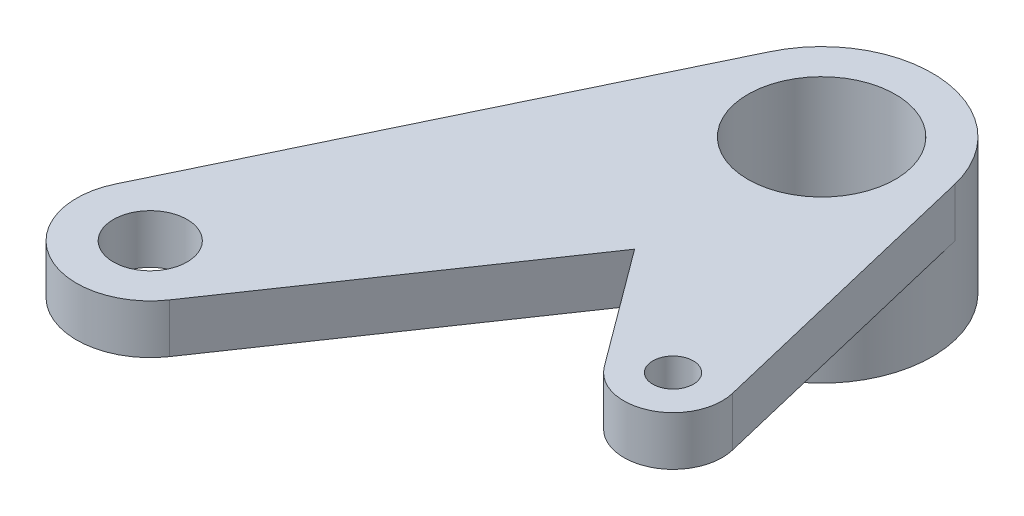
ISO-10303-21;
HEADER;
FILE_DESCRIPTION(('STEP AP214'),'2;1');
FILE_NAME('part.step','',(''),(''),'','','');
FILE_SCHEMA(('AUTOMOTIVE_DESIGN { 1 0 10303 214 1 1 1 1 }'));
ENDSEC;
DATA;
#1=APPLICATION_CONTEXT('core data for automotive mechanical design processes');
#2=APPLICATION_PROTOCOL_DEFINITION('international standard','automotive_design',2000,#1);
#3=PRODUCT_CONTEXT('',#1,'mechanical');
#4=PRODUCT('Part','Part','',(#3));
#5=PRODUCT_RELATED_PRODUCT_CATEGORY('part','',(#4));
#6=PRODUCT_DEFINITION_FORMATION('','',#4);
#7=PRODUCT_DEFINITION_CONTEXT('part definition',#1,'design');
#8=PRODUCT_DEFINITION('design','',#6,#7);
#9=PRODUCT_DEFINITION_SHAPE('','',#8);
#10=(LENGTH_UNIT() NAMED_UNIT(*) SI_UNIT(.MILLI.,.METRE.));
#11=(NAMED_UNIT(*) PLANE_ANGLE_UNIT() SI_UNIT($,.RADIAN.));
#12=(NAMED_UNIT(*) SI_UNIT($,.STERADIAN.) SOLID_ANGLE_UNIT());
#13=UNCERTAINTY_MEASURE_WITH_UNIT(LENGTH_MEASURE(1.E-05),#10,'distance_accuracy_value','');
#14=(GEOMETRIC_REPRESENTATION_CONTEXT(3) GLOBAL_UNCERTAINTY_ASSIGNED_CONTEXT((#13)) GLOBAL_UNIT_ASSIGNED_CONTEXT((#10,
#11,#12)) REPRESENTATION_CONTEXT('',''));
#15=CARTESIAN_POINT('',(0.,0.,0.));
#16=DIRECTION('',(0.,0.,1.));
#17=DIRECTION('',(1.,0.,0.));
#18=AXIS2_PLACEMENT_3D('',#15,#16,#17);
#19=CARTESIAN_POINT('',(4.16810157618354,7.29527531791811,-12.2850422261165));
#20=DIRECTION('',(0.,-1.,0.));
#21=DIRECTION('',(0.,0.,-1.));
#22=AXIS2_PLACEMENT_3D('',#19,#20,#21);
#23=CYLINDRICAL_SURFACE('',#22,18.);
#24=DIRECTION('',(0.,-1.,0.));
#25=VECTOR('',#24,1.);
#26=CARTESIAN_POINT('',(21.6734670411358,7.29527531791811,-16.4757676929608));
#27=LINE('',#26,#25);
#28=CARTESIAN_POINT('',(21.6734670411358,7.29527531791811,-16.4757676929608));
#29=VERTEX_POINT('',#28);
#30=CARTESIAN_POINT('',(21.6734670411358,-0.704724682081886,-16.4757676929608));
#31=VERTEX_POINT('',#30);
#32=EDGE_CURVE('E125',#29,#31,#27,.T.);
#33=ORIENTED_EDGE('',*,*,#32,.T.);
#34=CARTESIAN_POINT('',(4.16810157618354,-0.704724682081886,-12.2850422261165));
#35=DIRECTION('',(0.,1.,0.));
#36=DIRECTION('',(0.,0.,1.));
#37=AXIS2_PLACEMENT_3D('',#34,#35,#36);
#38=CIRCLE('',#37,18.);
#39=CARTESIAN_POINT('',(-12.0514513282907,-0.704724682081886,-20.0905597348381));
#40=VERTEX_POINT('',#39);
#41=EDGE_CURVE('E11',#40,#31,#38,.T.);
#42=ORIENTED_EDGE('',*,*,#41,.F.);
#43=DIRECTION('',(0.,-1.,0.));
#44=VECTOR('',#43,1.);
#45=CARTESIAN_POINT('',(-12.0514513282907,7.29527531791811,-20.0905597348381));
#46=LINE('',#45,#44);
#47=CARTESIAN_POINT('',(-12.0514513282907,7.29527531791811,-20.0905597348381));
#48=VERTEX_POINT('',#47);
#49=EDGE_CURVE('E46',#48,#40,#46,.T.);
#50=ORIENTED_EDGE('',*,*,#49,.F.);
#51=CARTESIAN_POINT('',(4.16810157618354,7.29527531791811,-12.2850422261165));
#52=DIRECTION('',(0.,1.,0.));
#53=DIRECTION('',(0.,0.,1.));
#54=AXIS2_PLACEMENT_3D('',#51,#52,#53);
#55=CIRCLE('',#54,18.);
#56=EDGE_CURVE('E140',#29,#48,#55,.T.);
#57=ORIENTED_EDGE('',*,*,#56,.F.);
#58=EDGE_LOOP('',(#33,#42,#50,#57));
#59=FACE_BOUND('',#58,.T.);
#60=CARTESIAN_POINT('',(4.16810157618354,-14.7047246820819,-12.2850422261165));
#61=DIRECTION('',(0.,1.,0.));
#62=DIRECTION('',(0.,0.,1.));
#63=AXIS2_PLACEMENT_3D('',#60,#61,#62);
#64=CIRCLE('',#63,18.);
#65=CARTESIAN_POINT('',(4.16810157618354,-14.7047246820819,5.71495777388353));
#66=VERTEX_POINT('',#65);
#67=EDGE_CURVE('E132',#66,#66,#64,.T.);
#68=ORIENTED_EDGE('',*,*,#67,.T.);
#69=EDGE_LOOP('',(#68));
#70=FACE_BOUND('',#69,.T.);
#71=ADVANCED_FACE('F37',(#59,#70),#23,.T.);
#72=CARTESIAN_POINT('',(-12.0514513282907,7.29527531791811,-20.0905597348381));
#73=DIRECTION('',(0.901086272470793,0.,0.433639861595646));
#74=DIRECTION('',(0.433639861595646,0.,-0.901086272470793));
#75=AXIS2_PLACEMENT_3D('',#72,#73,#74);
#76=PLANE('',#75);
#77=DIRECTION('',(-0.433639861595646,0.,0.901086272470793));
#78=VECTOR('',#77,1.);
#79=CARTESIAN_POINT('',(-12.0514513282907,-0.704724682081886,-20.0905597348381));
#80=LINE('',#79,#78);
#81=CARTESIAN_POINT('',(-46.6449336934661,-0.704724682081886,51.7933117374908));
#82=VERTEX_POINT('',#81);
#83=EDGE_CURVE('E129',#40,#82,#80,.T.);
#84=ORIENTED_EDGE('',*,*,#83,.T.);
#85=DIRECTION('',(0.,-1.,0.));
#86=VECTOR('',#85,1.);
#87=CARTESIAN_POINT('',(-46.6449336934661,7.29527531791811,51.7933117374908));
#88=LINE('',#87,#86);
#89=CARTESIAN_POINT('',(-46.6449336934661,7.29527531791811,51.7933117374908));
#90=VERTEX_POINT('',#89);
#91=EDGE_CURVE('E148',#90,#82,#88,.T.);
#92=ORIENTED_EDGE('',*,*,#91,.F.);
#93=DIRECTION('',(-0.433639861595646,0.,0.901086272470793));
#94=VECTOR('',#93,1.);
#95=CARTESIAN_POINT('',(-12.0514513282907,7.29527531791811,-20.0905597348381));
#96=LINE('',#95,#94);
#97=EDGE_CURVE('E94',#48,#90,#96,.T.);
#98=ORIENTED_EDGE('',*,*,#97,.F.);
#99=ORIENTED_EDGE('',*,*,#49,.T.);
#100=EDGE_LOOP('',(#84,#92,#98,#99));
#101=FACE_BOUND('',#100,.T.);
#102=ADVANCED_FACE('F192',(#101),#76,.F.);
#103=CARTESIAN_POINT('',(-35.8318984238165,7.29527531791811,56.9969900766386));
#104=DIRECTION('',(0.,-1.,0.));
#105=DIRECTION('',(0.,0.,-1.));
#106=AXIS2_PLACEMENT_3D('',#103,#104,#105);
#107=CYLINDRICAL_SURFACE('',#106,12.);
#108=CARTESIAN_POINT('',(-35.8318984238165,-0.704724682081886,56.9969900766386));
#109=DIRECTION('',(0.,1.,0.));
#110=DIRECTION('',(0.,0.,1.));
#111=AXIS2_PLACEMENT_3D('',#108,#109,#110);
#112=CIRCLE('',#111,12.);
#113=CARTESIAN_POINT('',(-25.918863154167,-0.704724682081886,63.7595141425983));
#114=VERTEX_POINT('',#113);
#115=EDGE_CURVE('E131',#82,#114,#112,.T.);
#116=ORIENTED_EDGE('',*,*,#115,.T.);
#117=DIRECTION('',(0.,-1.,0.));
#118=VECTOR('',#117,1.);
#119=CARTESIAN_POINT('',(-25.918863154167,7.29527531791811,63.7595141425983));
#120=LINE('',#119,#118);
#121=CARTESIAN_POINT('',(-25.918863154167,7.29527531791811,63.7595141425983));
#122=VERTEX_POINT('',#121);
#123=EDGE_CURVE('E145',#122,#114,#120,.T.);
#124=ORIENTED_EDGE('',*,*,#123,.F.);
#125=CARTESIAN_POINT('',(-35.8318984238165,7.29527531791811,56.9969900766386));
#126=DIRECTION('',(0.,1.,0.));
#127=DIRECTION('',(0.,0.,1.));
#128=AXIS2_PLACEMENT_3D('',#125,#126,#127);
#129=CIRCLE('',#128,12.);
#130=EDGE_CURVE('E176',#90,#122,#129,.T.);
#131=ORIENTED_EDGE('',*,*,#130,.F.);
#132=ORIENTED_EDGE('',*,*,#91,.T.);
#133=EDGE_LOOP('',(#116,#124,#131,#132));
#134=FACE_BOUND('',#133,.T.);
#135=ADVANCED_FACE('F180',(#134),#107,.T.);
#136=CARTESIAN_POINT('',(4.77402818421152,7.29527531791811,18.7674798966269));
#137=DIRECTION('',(-0.826086272470793,0.,-0.563543672163312));
#138=DIRECTION('',(-0.563543672163312,0.,0.826086272470793));
#139=AXIS2_PLACEMENT_3D('',#136,#137,#138);
#140=PLANE('',#139);
#141=DIRECTION('',(0.563543672163312,0.,-0.826086272470793));
#142=VECTOR('',#141,1.);
#143=CARTESIAN_POINT('',(4.77402818421152,-0.704724682081886,18.7674798966269));
#144=LINE('',#143,#142);
#145=CARTESIAN_POINT('',(4.77402818421152,-0.704724682081886,18.7674798966269));
#146=VERTEX_POINT('',#145);
#147=EDGE_CURVE('E134',#114,#146,#144,.T.);
#148=ORIENTED_EDGE('',*,*,#147,.T.);
#149=DIRECTION('',(0.,-1.,0.));
#150=VECTOR('',#149,1.);
#151=CARTESIAN_POINT('',(4.77402818421152,7.29527531791811,18.7674798966269));
#152=LINE('',#151,#150);
#153=CARTESIAN_POINT('',(4.77402818421152,7.29527531791811,18.7674798966269));
#154=VERTEX_POINT('',#153);
#155=EDGE_CURVE('E120',#154,#146,#152,.T.);
#156=ORIENTED_EDGE('',*,*,#155,.F.);
#157=DIRECTION('',(0.563543672163312,0.,-0.826086272470793));
#158=VECTOR('',#157,1.);
#159=CARTESIAN_POINT('',(4.77402818421152,7.29527531791811,18.7674798966269));
#160=LINE('',#159,#158);
#161=EDGE_CURVE('E111',#122,#154,#160,.T.);
#162=ORIENTED_EDGE('',*,*,#161,.F.);
#163=ORIENTED_EDGE('',*,*,#123,.T.);
#164=EDGE_LOOP('',(#148,#156,#162,#163));
#165=FACE_BOUND('',#164,.T.);
#166=ADVANCED_FACE('F184',(#165),#140,.F.);
#167=CARTESIAN_POINT('',(18.8712306719212,7.29527531791811,37.7930766961641));
#168=DIRECTION('',(0.803472998912177,0.,-0.595341196306011));
#169=DIRECTION('',(-0.595341196306011,0.,-0.803472998912177));
#170=AXIS2_PLACEMENT_3D('',#167,#168,#169);
#171=PLANE('',#170);
#172=DIRECTION('',(0.595341196306011,0.,0.803472998912177));
#173=VECTOR('',#172,1.);
#174=CARTESIAN_POINT('',(18.8712306719212,-0.704724682081886,37.7930766961641));
#175=LINE('',#174,#173);
#176=CARTESIAN_POINT('',(18.8712306719212,-0.704724682081886,37.7930766961641));
#177=VERTEX_POINT('',#176);
#178=EDGE_CURVE('E119',#146,#177,#175,.T.);
#179=ORIENTED_EDGE('',*,*,#178,.T.);
#180=DIRECTION('',(0.,-1.,0.));
#181=VECTOR('',#180,1.);
#182=CARTESIAN_POINT('',(18.8712306719212,7.29527531791811,37.7930766961641));
#183=LINE('',#182,#181);
#184=CARTESIAN_POINT('',(18.8712306719212,7.29527531791811,37.7930766961641));
#185=VERTEX_POINT('',#184);
#186=EDGE_CURVE('E116',#185,#177,#183,.T.);
#187=ORIENTED_EDGE('',*,*,#186,.F.);
#188=DIRECTION('',(0.595341196306011,0.,0.803472998912177));
#189=VECTOR('',#188,1.);
#190=CARTESIAN_POINT('',(18.8712306719212,7.29527531791811,37.7930766961641));
#191=LINE('',#190,#189);
#192=EDGE_CURVE('E105',#154,#185,#191,.T.);
#193=ORIENTED_EDGE('',*,*,#192,.F.);
#194=ORIENTED_EDGE('',*,*,#155,.T.);
#195=EDGE_LOOP('',(#179,#187,#193,#194));
#196=FACE_BOUND('',#195,.T.);
#197=ADVANCED_FACE('F117',(#196),#171,.F.);
#198=CARTESIAN_POINT('',(25.2990146632186,7.29527531791811,33.030347125716));
#199=DIRECTION('',(0.,-1.,0.));
#200=DIRECTION('',(0.,0.,-1.));
#201=AXIS2_PLACEMENT_3D('',#198,#199,#200);
#202=CYLINDRICAL_SURFACE('',#201,8.);
#203=CARTESIAN_POINT('',(25.2990146632186,-0.704724682081886,33.030347125716));
#204=DIRECTION('',(0.,1.,0.));
#205=DIRECTION('',(0.,0.,1.));
#206=AXIS2_PLACEMENT_3D('',#203,#204,#205);
#207=CIRCLE('',#206,8.);
#208=CARTESIAN_POINT('',(33.0791770920862,-0.704724682081886,31.1678024737852));
#209=VERTEX_POINT('',#208);
#210=EDGE_CURVE('E79',#177,#209,#207,.T.);
#211=ORIENTED_EDGE('',*,*,#210,.T.);
#212=DIRECTION('',(0.,-1.,0.));
#213=VECTOR('',#212,1.);
#214=CARTESIAN_POINT('',(33.0791770920862,7.29527531791811,31.1678024737852));
#215=LINE('',#214,#213);
#216=CARTESIAN_POINT('',(33.0791770920862,7.29527531791811,31.1678024737852));
#217=VERTEX_POINT('',#216);
#218=EDGE_CURVE('E121',#217,#209,#215,.T.);
#219=ORIENTED_EDGE('',*,*,#218,.F.);
#220=CARTESIAN_POINT('',(25.2990146632186,7.29527531791811,33.030347125716));
#221=DIRECTION('',(0.,1.,0.));
#222=DIRECTION('',(0.,0.,1.));
#223=AXIS2_PLACEMENT_3D('',#220,#221,#222);
#224=CIRCLE('',#223,8.);
#225=EDGE_CURVE('E109',#185,#217,#224,.T.);
#226=ORIENTED_EDGE('',*,*,#225,.F.);
#227=ORIENTED_EDGE('',*,*,#186,.T.);
#228=EDGE_LOOP('',(#211,#219,#226,#227));
#229=FACE_BOUND('',#228,.T.);
#230=ADVANCED_FACE('F123',(#229),#202,.T.);
#231=CARTESIAN_POINT('',(21.6734670411358,7.29527531791811,-16.4757676929608));
#232=DIRECTION('',(-0.972520303608458,0.,0.232818081491352));
#233=DIRECTION('',(0.232818081491352,0.,0.972520303608458));
#234=AXIS2_PLACEMENT_3D('',#231,#232,#233);
#235=PLANE('',#234);
#236=DIRECTION('',(-0.232818081491352,0.,-0.972520303608458));
#237=VECTOR('',#236,1.);
#238=CARTESIAN_POINT('',(21.6734670411358,-0.704724682081886,-16.4757676929608));
#239=LINE('',#238,#237);
#240=EDGE_CURVE('E138',#209,#31,#239,.T.);
#241=ORIENTED_EDGE('',*,*,#240,.T.);
#242=ORIENTED_EDGE('',*,*,#32,.F.);
#243=DIRECTION('',(-0.232818081491352,0.,-0.972520303608458));
#244=VECTOR('',#243,1.);
#245=CARTESIAN_POINT('',(21.6734670411358,7.29527531791811,-16.4757676929608));
#246=LINE('',#245,#244);
#247=EDGE_CURVE('E55',#217,#29,#246,.T.);
#248=ORIENTED_EDGE('',*,*,#247,.F.);
#249=ORIENTED_EDGE('',*,*,#218,.T.);
#250=EDGE_LOOP('',(#241,#242,#248,#249));
#251=FACE_BOUND('',#250,.T.);
#252=ADVANCED_FACE('F187',(#251),#235,.F.);
#253=CARTESIAN_POINT('',(4.16810157618354,7.29527531791811,-12.2850422261165));
#254=DIRECTION('',(0.,1.,0.));
#255=DIRECTION('',(0.,0.,1.));
#256=AXIS2_PLACEMENT_3D('',#253,#254,#255);
#257=PLANE('',#256);
#258=CARTESIAN_POINT('',(4.16810157618354,7.29527531791811,-12.2850422261165));
#259=DIRECTION('',(0.,1.,0.));
#260=DIRECTION('',(0.,0.,1.));
#261=AXIS2_PLACEMENT_3D('',#258,#259,#260);
#262=CIRCLE('',#261,12.);
#263=CARTESIAN_POINT('',(4.16810157618354,7.29527531791811,-0.285042226116474));
#264=VERTEX_POINT('',#263);
#265=EDGE_CURVE('E168',#264,#264,#262,.T.);
#266=ORIENTED_EDGE('',*,*,#265,.F.);
#267=EDGE_LOOP('',(#266));
#268=FACE_BOUND('',#267,.T.);
#269=CARTESIAN_POINT('',(25.2990146632186,7.29527531791812,33.030347125716));
#270=DIRECTION('',(0.,1.,0.));
#271=DIRECTION('',(0.,0.,1.));
#272=AXIS2_PLACEMENT_3D('',#269,#270,#271);
#273=CIRCLE('',#272,3.29999999999998);
#274=CARTESIAN_POINT('',(25.2990146632186,7.29527531791812,36.330347125716));
#275=VERTEX_POINT('',#274);
#276=EDGE_CURVE('E157',#275,#275,#273,.T.);
#277=ORIENTED_EDGE('',*,*,#276,.F.);
#278=EDGE_LOOP('',(#277));
#279=FACE_BOUND('',#278,.T.);
#280=CARTESIAN_POINT('',(-35.8318984238165,7.29527531791811,56.9969900766386));
#281=DIRECTION('',(0.,1.,0.));
#282=DIRECTION('',(0.,0.,1.));
#283=AXIS2_PLACEMENT_3D('',#280,#281,#282);
#284=CIRCLE('',#283,6.);
#285=CARTESIAN_POINT('',(-35.8318984238165,7.29527531791811,62.9969900766386));
#286=VERTEX_POINT('',#285);
#287=EDGE_CURVE('E154',#286,#286,#284,.T.);
#288=ORIENTED_EDGE('',*,*,#287,.F.);
#289=EDGE_LOOP('',(#288));
#290=FACE_BOUND('',#289,.T.);
#291=ORIENTED_EDGE('',*,*,#247,.T.);
#292=ORIENTED_EDGE('',*,*,#56,.T.);
#293=ORIENTED_EDGE('',*,*,#97,.T.);
#294=ORIENTED_EDGE('',*,*,#130,.T.);
#295=ORIENTED_EDGE('',*,*,#161,.T.);
#296=ORIENTED_EDGE('',*,*,#192,.T.);
#297=ORIENTED_EDGE('',*,*,#225,.T.);
#298=EDGE_LOOP('',(#291,#292,#293,#294,#295,#296,#297));
#299=FACE_BOUND('',#298,.T.);
#300=ADVANCED_FACE('F107',(#268,#279,#290,#299),#257,.T.);
#301=CARTESIAN_POINT('',(4.16810157618354,-0.704724682081886,-12.2850422261165));
#302=DIRECTION('',(0.,1.,0.));
#303=DIRECTION('',(0.,0.,1.));
#304=AXIS2_PLACEMENT_3D('',#301,#302,#303);
#305=PLANE('',#304);
#306=CARTESIAN_POINT('',(25.2990146632186,-0.704724682081886,33.030347125716));
#307=DIRECTION('',(0.,1.,0.));
#308=DIRECTION('',(0.,0.,1.));
#309=AXIS2_PLACEMENT_3D('',#306,#307,#308);
#310=CIRCLE('',#309,3.29999999999999);
#311=CARTESIAN_POINT('',(25.2990146632186,-0.704724682081886,36.330347125716));
#312=VERTEX_POINT('',#311);
#313=EDGE_CURVE('E155',#312,#312,#310,.T.);
#314=ORIENTED_EDGE('',*,*,#313,.T.);
#315=EDGE_LOOP('',(#314));
#316=FACE_BOUND('',#315,.T.);
#317=CARTESIAN_POINT('',(-35.8318984238165,-0.704724682081886,56.9969900766386));
#318=DIRECTION('',(0.,1.,0.));
#319=DIRECTION('',(0.,0.,1.));
#320=AXIS2_PLACEMENT_3D('',#317,#318,#319);
#321=CIRCLE('',#320,6.);
#322=CARTESIAN_POINT('',(-35.8318984238165,-0.704724682081886,62.9969900766386));
#323=VERTEX_POINT('',#322);
#324=EDGE_CURVE('E152',#323,#323,#321,.T.);
#325=ORIENTED_EDGE('',*,*,#324,.T.);
#326=EDGE_LOOP('',(#325));
#327=FACE_BOUND('',#326,.T.);
#328=ORIENTED_EDGE('',*,*,#83,.F.);
#329=ORIENTED_EDGE('',*,*,#41,.T.);
#330=ORIENTED_EDGE('',*,*,#240,.F.);
#331=ORIENTED_EDGE('',*,*,#210,.F.);
#332=ORIENTED_EDGE('',*,*,#178,.F.);
#333=ORIENTED_EDGE('',*,*,#147,.F.);
#334=ORIENTED_EDGE('',*,*,#115,.F.);
#335=EDGE_LOOP('',(#328,#329,#330,#331,#332,#333,#334));
#336=FACE_BOUND('',#335,.T.);
#337=ADVANCED_FACE('F185',(#316,#327,#336),#305,.F.);
#338=CARTESIAN_POINT('',(4.16810157618354,-14.7047246820819,-12.2850422261165));
#339=DIRECTION('',(0.,1.,0.));
#340=DIRECTION('',(0.,0.,1.));
#341=AXIS2_PLACEMENT_3D('',#338,#339,#340);
#342=PLANE('',#341);
#343=CARTESIAN_POINT('',(4.16810157618354,-14.7047246820819,-12.2850422261165));
#344=DIRECTION('',(0.,-1.,0.));
#345=DIRECTION('',(0.,0.,-1.));
#346=AXIS2_PLACEMENT_3D('',#343,#344,#345);
#347=CIRCLE('',#346,11.);
#348=CARTESIAN_POINT('',(4.16810157618354,-14.7047246820819,-23.2850422261165));
#349=VERTEX_POINT('',#348);
#350=EDGE_CURVE('E242',#349,#349,#347,.T.);
#351=ORIENTED_EDGE('',*,*,#350,.F.);
#352=EDGE_LOOP('',(#351));
#353=FACE_BOUND('',#352,.T.);
#354=ORIENTED_EDGE('',*,*,#67,.F.);
#355=EDGE_LOOP('',(#354));
#356=FACE_BOUND('',#355,.T.);
#357=ADVANCED_FACE('F210',(#353,#356),#342,.F.);
#358=CARTESIAN_POINT('',(-35.8318984238165,-14.7047246820819,56.9969900766386));
#359=DIRECTION('',(0.,1.,0.));
#360=DIRECTION('',(0.,0.,1.));
#361=AXIS2_PLACEMENT_3D('',#358,#359,#360);
#362=CYLINDRICAL_SURFACE('',#361,6.);
#363=ORIENTED_EDGE('',*,*,#287,.T.);
#364=EDGE_LOOP('',(#363));
#365=FACE_BOUND('',#364,.T.);
#366=ORIENTED_EDGE('',*,*,#324,.F.);
#367=EDGE_LOOP('',(#366));
#368=FACE_BOUND('',#367,.T.);
#369=ADVANCED_FACE('F216',(#365,#368),#362,.F.);
#370=CARTESIAN_POINT('',(25.2990146632186,7.29527531791811,33.030347125716));
#371=DIRECTION('',(0.,1.,0.));
#372=DIRECTION('',(0.,0.,1.));
#373=AXIS2_PLACEMENT_3D('',#370,#371,#372);
#374=CYLINDRICAL_SURFACE('',#373,3.29999999999999);
#375=ORIENTED_EDGE('',*,*,#276,.T.);
#376=EDGE_LOOP('',(#375));
#377=FACE_BOUND('',#376,.T.);
#378=ORIENTED_EDGE('',*,*,#313,.F.);
#379=EDGE_LOOP('',(#378));
#380=FACE_BOUND('',#379,.T.);
#381=ADVANCED_FACE('F220',(#377,#380),#374,.F.);
#382=CARTESIAN_POINT('',(4.16810157618354,-12.7047246820819,-12.2850422261165));
#383=DIRECTION('',(0.,1.,0.));
#384=DIRECTION('',(0.,0.,1.));
#385=AXIS2_PLACEMENT_3D('',#382,#383,#384);
#386=CYLINDRICAL_SURFACE('',#385,12.);
#387=CARTESIAN_POINT('',(4.16810157618354,-12.7047246820819,-12.2850422261165));
#388=DIRECTION('',(0.,1.,0.));
#389=DIRECTION('',(0.,0.,1.));
#390=AXIS2_PLACEMENT_3D('',#387,#388,#389);
#391=CIRCLE('',#390,12.);
#392=CARTESIAN_POINT('',(4.16810157618354,-12.7047246820819,-0.285042226116474));
#393=VERTEX_POINT('',#392);
#394=EDGE_CURVE('E163',#393,#393,#391,.T.);
#395=ORIENTED_EDGE('',*,*,#394,.F.);
#396=EDGE_LOOP('',(#395));
#397=FACE_BOUND('',#396,.T.);
#398=ORIENTED_EDGE('',*,*,#265,.T.);
#399=EDGE_LOOP('',(#398));
#400=FACE_BOUND('',#399,.T.);
#401=ADVANCED_FACE('F224',(#397,#400),#386,.F.);
#402=CARTESIAN_POINT('',(4.16810157618354,-12.7047246820819,-12.2850422261165));
#403=DIRECTION('',(0.,1.,0.));
#404=DIRECTION('',(0.,0.,1.));
#405=AXIS2_PLACEMENT_3D('',#402,#403,#404);
#406=PLANE('',#405);
#407=CARTESIAN_POINT('',(4.16810157618354,-12.7047246820819,-12.2850422261165));
#408=DIRECTION('',(0.,1.,0.));
#409=DIRECTION('',(0.,0.,1.));
#410=AXIS2_PLACEMENT_3D('',#407,#408,#409);
#411=CIRCLE('',#410,11.);
#412=CARTESIAN_POINT('',(4.16810157618354,-12.7047246820819,-1.28504222611648));
#413=VERTEX_POINT('',#412);
#414=EDGE_CURVE('E40',#413,#413,#411,.T.);
#415=ORIENTED_EDGE('',*,*,#414,.F.);
#416=EDGE_LOOP('',(#415));
#417=FACE_BOUND('',#416,.T.);
#418=ORIENTED_EDGE('',*,*,#394,.T.);
#419=EDGE_LOOP('',(#418));
#420=FACE_BOUND('',#419,.T.);
#421=ADVANCED_FACE('F227',(#417,#420),#406,.T.);
#422=CARTESIAN_POINT('',(4.16810157618354,7.29527531791812,-12.2850422261165));
#423=DIRECTION('',(0.,-1.,0.));
#424=DIRECTION('',(0.,0.,-1.));
#425=AXIS2_PLACEMENT_3D('',#422,#423,#424);
#426=CYLINDRICAL_SURFACE('',#425,11.);
#427=ORIENTED_EDGE('',*,*,#414,.T.);
#428=EDGE_LOOP('',(#427));
#429=FACE_BOUND('',#428,.T.);
#430=ORIENTED_EDGE('',*,*,#350,.T.);
#431=EDGE_LOOP('',(#430));
#432=FACE_BOUND('',#431,.T.);
#433=ADVANCED_FACE('F231',(#429,#432),#426,.F.);
#434=CLOSED_SHELL('',(#71,#102,#135,#166,#197,#230,#252,#300,#337,#357,#369,#381,#401,#421,#433));
#435=MANIFOLD_SOLID_BREP('B2',#434);
#436=ADVANCED_BREP_SHAPE_REPRESENTATION('',(#18,#435),#14);
#437=SHAPE_DEFINITION_REPRESENTATION(#9,#436);
ENDSEC;
END-ISO-10303-21;
